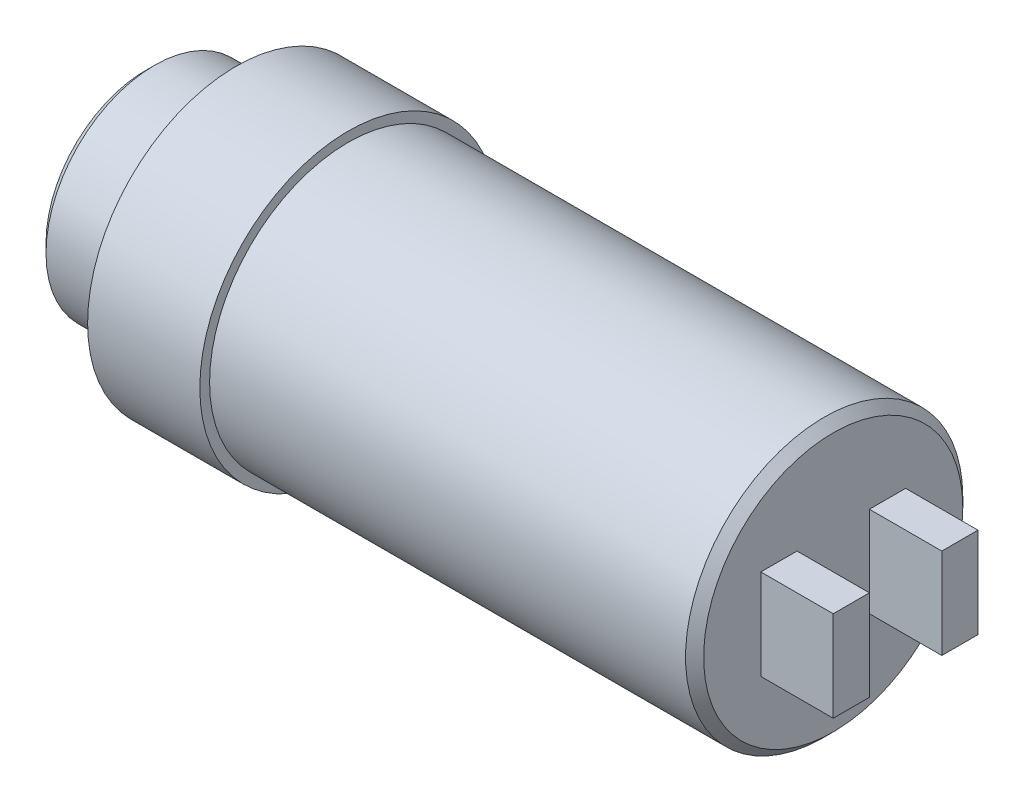
ISO-10303-21;
HEADER;
FILE_DESCRIPTION(('STEP AP214'),'2;1');
FILE_NAME('part.step','',(''),(''),'','','');
FILE_SCHEMA(('AUTOMOTIVE_DESIGN { 1 0 10303 214 1 1 1 1 }'));
ENDSEC;
DATA;
#1=APPLICATION_CONTEXT('core data for automotive mechanical design processes');
#2=APPLICATION_PROTOCOL_DEFINITION('international standard','automotive_design',2000,#1);
#3=PRODUCT_CONTEXT('',#1,'mechanical');
#4=PRODUCT('Part','Part','',(#3));
#5=PRODUCT_RELATED_PRODUCT_CATEGORY('part','',(#4));
#6=PRODUCT_DEFINITION_FORMATION('','',#4);
#7=PRODUCT_DEFINITION_CONTEXT('part definition',#1,'design');
#8=PRODUCT_DEFINITION('design','',#6,#7);
#9=PRODUCT_DEFINITION_SHAPE('','',#8);
#10=(LENGTH_UNIT() NAMED_UNIT(*) SI_UNIT(.MILLI.,.METRE.));
#11=(NAMED_UNIT(*) PLANE_ANGLE_UNIT() SI_UNIT($,.RADIAN.));
#12=(NAMED_UNIT(*) SI_UNIT($,.STERADIAN.) SOLID_ANGLE_UNIT());
#13=UNCERTAINTY_MEASURE_WITH_UNIT(LENGTH_MEASURE(1.E-05),#10,'distance_accuracy_value','');
#14=(GEOMETRIC_REPRESENTATION_CONTEXT(3) GLOBAL_UNCERTAINTY_ASSIGNED_CONTEXT((#13)) GLOBAL_UNIT_ASSIGNED_CONTEXT((#10,
#11,#12)) REPRESENTATION_CONTEXT('',''));
#15=CARTESIAN_POINT('',(0.,0.,0.));
#16=DIRECTION('',(0.,0.,1.));
#17=DIRECTION('',(1.,0.,0.));
#18=AXIS2_PLACEMENT_3D('',#15,#16,#17);
#19=CARTESIAN_POINT('',(0.,0.,0.));
#20=DIRECTION('',(-1.,0.,0.));
#21=DIRECTION('',(0.,0.,1.));
#22=AXIS2_PLACEMENT_3D('',#19,#20,#21);
#23=PLANE('',#22);
#24=CARTESIAN_POINT('',(0.,0.,0.));
#25=DIRECTION('',(-1.,0.,0.));
#26=DIRECTION('',(0.,0.,1.));
#27=AXIS2_PLACEMENT_3D('',#24,#25,#26);
#28=CIRCLE('',#27,2.75);
#29=CARTESIAN_POINT('',(0.,0.,2.75));
#30=VERTEX_POINT('',#29);
#31=EDGE_CURVE('E49',#30,#30,#28,.T.);
#32=ORIENTED_EDGE('',*,*,#31,.T.);
#33=EDGE_LOOP('',(#32));
#34=FACE_BOUND('',#33,.T.);
#35=CARTESIAN_POINT('',(0.,0.,0.));
#36=DIRECTION('',(-1.,0.,0.));
#37=DIRECTION('',(0.,0.,1.));
#38=AXIS2_PLACEMENT_3D('',#35,#36,#37);
#39=CIRCLE('',#38,1.99999999999999);
#40=CARTESIAN_POINT('',(0.,0.,1.99999999999999));
#41=VERTEX_POINT('',#40);
#42=EDGE_CURVE('E181',#41,#41,#39,.F.);
#43=ORIENTED_EDGE('',*,*,#42,.T.);
#44=EDGE_LOOP('',(#43));
#45=FACE_BOUND('',#44,.T.);
#46=ADVANCED_FACE('F40',(#34,#45),#23,.T.);
#47=CARTESIAN_POINT('',(19.,0.,0.));
#48=DIRECTION('',(1.,0.,0.));
#49=DIRECTION('',(0.,0.,-1.));
#50=AXIS2_PLACEMENT_3D('',#47,#48,#49);
#51=CYLINDRICAL_SURFACE('',#50,3.);
#52=CARTESIAN_POINT('',(0.249999999999997,0.,0.));
#53=DIRECTION('',(-1.,0.,0.));
#54=DIRECTION('',(0.,0.,1.));
#55=AXIS2_PLACEMENT_3D('',#52,#53,#54);
#56=CIRCLE('',#55,3.);
#57=CARTESIAN_POINT('',(0.249999999999997,0.,3.));
#58=VERTEX_POINT('',#57);
#59=EDGE_CURVE('E178',#58,#58,#56,.F.);
#60=ORIENTED_EDGE('',*,*,#59,.T.);
#61=EDGE_LOOP('',(#60));
#62=FACE_BOUND('',#61,.T.);
#63=CARTESIAN_POINT('',(2.5,0.,0.));
#64=DIRECTION('',(1.,0.,0.));
#65=DIRECTION('',(0.,0.,-1.));
#66=AXIS2_PLACEMENT_3D('',#63,#64,#65);
#67=CIRCLE('',#66,3.);
#68=CARTESIAN_POINT('',(2.5,0.,-3.));
#69=VERTEX_POINT('',#68);
#70=EDGE_CURVE('E169',#69,#69,#67,.T.);
#71=ORIENTED_EDGE('',*,*,#70,.F.);
#72=EDGE_LOOP('',(#71));
#73=FACE_BOUND('',#72,.T.);
#74=ADVANCED_FACE('F194',(#62,#73),#51,.T.);
#75=CARTESIAN_POINT('',(2.5,0.,-3.));
#76=DIRECTION('',(-1.,0.,0.));
#77=DIRECTION('',(0.,0.,1.));
#78=AXIS2_PLACEMENT_3D('',#75,#76,#77);
#79=PLANE('',#78);
#80=ORIENTED_EDGE('',*,*,#70,.T.);
#81=EDGE_LOOP('',(#80));
#82=FACE_BOUND('',#81,.T.);
#83=CARTESIAN_POINT('',(2.5,0.,0.));
#84=DIRECTION('',(-1.,0.,0.));
#85=DIRECTION('',(0.,0.,1.));
#86=AXIS2_PLACEMENT_3D('',#83,#84,#85);
#87=CIRCLE('',#86,4.10031535016329);
#88=CARTESIAN_POINT('',(2.5,0.,4.10031535016329));
#89=VERTEX_POINT('',#88);
#90=EDGE_CURVE('E207',#89,#89,#87,.T.);
#91=ORIENTED_EDGE('',*,*,#90,.T.);
#92=EDGE_LOOP('',(#91));
#93=FACE_BOUND('',#92,.T.);
#94=ADVANCED_FACE('F197',(#82,#93),#79,.T.);
#95=CARTESIAN_POINT('',(17.,0.,0.));
#96=DIRECTION('',(-1.,0.,0.));
#97=DIRECTION('',(0.,0.,1.));
#98=AXIS2_PLACEMENT_3D('',#95,#96,#97);
#99=CYLINDRICAL_SURFACE('',#98,1.75);
#100=CARTESIAN_POINT('',(0.249999999999997,0.,0.));
#101=DIRECTION('',(-1.,0.,0.));
#102=DIRECTION('',(0.,0.,1.));
#103=AXIS2_PLACEMENT_3D('',#100,#101,#102);
#104=CIRCLE('',#103,1.75);
#105=CARTESIAN_POINT('',(0.249999999999997,0.,1.75));
#106=VERTEX_POINT('',#105);
#107=EDGE_CURVE('E11',#106,#106,#104,.T.);
#108=ORIENTED_EDGE('',*,*,#107,.T.);
#109=EDGE_LOOP('',(#108));
#110=FACE_BOUND('',#109,.T.);
#111=CARTESIAN_POINT('',(17.,0.,0.));
#112=DIRECTION('',(-1.,0.,0.));
#113=DIRECTION('',(0.,0.,1.));
#114=AXIS2_PLACEMENT_3D('',#111,#112,#113);
#115=CIRCLE('',#114,1.75);
#116=CARTESIAN_POINT('',(17.,0.,1.75));
#117=VERTEX_POINT('',#116);
#118=EDGE_CURVE('E166',#117,#117,#115,.T.);
#119=ORIENTED_EDGE('',*,*,#118,.F.);
#120=EDGE_LOOP('',(#119));
#121=FACE_BOUND('',#120,.T.);
#122=ADVANCED_FACE('F203',(#110,#121),#99,.F.);
#123=CARTESIAN_POINT('',(17.,0.,0.));
#124=DIRECTION('',(-1.,0.,0.));
#125=DIRECTION('',(0.,0.,1.));
#126=AXIS2_PLACEMENT_3D('',#123,#124,#125);
#127=PLANE('',#126);
#128=ORIENTED_EDGE('',*,*,#118,.T.);
#129=EDGE_LOOP('',(#128));
#130=FACE_BOUND('',#129,.T.);
#131=ADVANCED_FACE('F191',(#130),#127,.T.);
#132=CARTESIAN_POINT('',(0.249999999999997,0.,0.));
#133=DIRECTION('',(1.,0.,0.));
#134=DIRECTION('',(0.,0.,-1.));
#135=AXIS2_PLACEMENT_3D('',#132,#133,#134);
#136=CONICAL_SURFACE('',#135,3.,0.78539816339745);
#137=ORIENTED_EDGE('',*,*,#31,.F.);
#138=EDGE_LOOP('',(#137));
#139=FACE_BOUND('',#138,.T.);
#140=ORIENTED_EDGE('',*,*,#59,.F.);
#141=EDGE_LOOP('',(#140));
#142=FACE_BOUND('',#141,.T.);
#143=ADVANCED_FACE('F188',(#139,#142),#136,.T.);
#144=CARTESIAN_POINT('',(0.249999999999997,0.,0.));
#145=DIRECTION('',(-1.,0.,0.));
#146=DIRECTION('',(0.,0.,1.));
#147=AXIS2_PLACEMENT_3D('',#144,#145,#146);
#148=CONICAL_SURFACE('',#147,1.75,0.785398163397445);
#149=ORIENTED_EDGE('',*,*,#42,.F.);
#150=EDGE_LOOP('',(#149));
#151=FACE_BOUND('',#150,.T.);
#152=ORIENTED_EDGE('',*,*,#107,.F.);
#153=EDGE_LOOP('',(#152));
#154=FACE_BOUND('',#153,.T.);
#155=ADVANCED_FACE('F43',(#151,#154),#148,.F.);
#156=CARTESIAN_POINT('',(5.6,0.,0.));
#157=DIRECTION('',(-1.,0.,0.));
#158=DIRECTION('',(0.,0.,1.));
#159=AXIS2_PLACEMENT_3D('',#156,#157,#158);
#160=CYLINDRICAL_SURFACE('',#159,4.10031535016329);
#161=CARTESIAN_POINT('',(5.6,0.,0.));
#162=DIRECTION('',(-1.,0.,0.));
#163=DIRECTION('',(0.,0.,1.));
#164=AXIS2_PLACEMENT_3D('',#161,#162,#163);
#165=CIRCLE('',#164,4.10031535016329);
#166=CARTESIAN_POINT('',(5.6,0.,4.10031535016329));
#167=VERTEX_POINT('',#166);
#168=EDGE_CURVE('E209',#167,#167,#165,.T.);
#169=CARTESIAN_POINT('',(5.6,0.,4.10031535016329));
#170=CARTESIAN_POINT('',(5.56770833333333,0.,4.10031535016329));
#171=CARTESIAN_POINT('',(5.53541666666667,0.,4.10031535016329));
#172=CARTESIAN_POINT('',(5.47083333333333,0.,4.10031535016329));
#173=CARTESIAN_POINT('',(5.43854166666667,0.,4.10031535016329));
#174=CARTESIAN_POINT('',(5.37395833333333,0.,4.10031535016329));
#175=CARTESIAN_POINT('',(5.34166666666667,0.,4.10031535016329));
#176=CARTESIAN_POINT('',(5.27708333333333,0.,4.10031535016329));
#177=CARTESIAN_POINT('',(5.24479166666667,0.,4.10031535016329));
#178=CARTESIAN_POINT('',(5.18020833333333,0.,4.10031535016329));
#179=CARTESIAN_POINT('',(5.14791666666667,0.,4.10031535016329));
#180=CARTESIAN_POINT('',(5.08333333333333,0.,4.10031535016329));
#181=CARTESIAN_POINT('',(5.05104166666667,0.,4.10031535016329));
#182=CARTESIAN_POINT('',(4.98645833333333,0.,4.10031535016329));
#183=CARTESIAN_POINT('',(4.95416666666667,0.,4.10031535016329));
#184=CARTESIAN_POINT('',(4.88958333333333,0.,4.10031535016329));
#185=CARTESIAN_POINT('',(4.85729166666667,0.,4.10031535016329));
#186=CARTESIAN_POINT('',(4.79270833333333,0.,4.10031535016329));
#187=CARTESIAN_POINT('',(4.76041666666667,0.,4.10031535016329));
#188=CARTESIAN_POINT('',(4.69583333333333,0.,4.10031535016329));
#189=CARTESIAN_POINT('',(4.66354166666667,0.,4.10031535016329));
#190=CARTESIAN_POINT('',(4.59895833333333,0.,4.10031535016329));
#191=CARTESIAN_POINT('',(4.56666666666667,0.,4.10031535016329));
#192=CARTESIAN_POINT('',(4.50208333333333,0.,4.10031535016329));
#193=CARTESIAN_POINT('',(4.46979166666667,0.,4.10031535016329));
#194=CARTESIAN_POINT('',(4.40520833333333,0.,4.10031535016329));
#195=CARTESIAN_POINT('',(4.37291666666667,0.,4.10031535016329));
#196=CARTESIAN_POINT('',(4.30833333333333,0.,4.10031535016329));
#197=CARTESIAN_POINT('',(4.27604166666667,0.,4.10031535016329));
#198=CARTESIAN_POINT('',(4.21145833333333,0.,4.10031535016329));
#199=CARTESIAN_POINT('',(4.17916666666667,0.,4.10031535016329));
#200=CARTESIAN_POINT('',(4.11458333333333,0.,4.10031535016329));
#201=CARTESIAN_POINT('',(4.08229166666667,0.,4.10031535016329));
#202=CARTESIAN_POINT('',(4.01770833333333,0.,4.10031535016329));
#203=CARTESIAN_POINT('',(3.98541666666667,0.,4.10031535016329));
#204=CARTESIAN_POINT('',(3.92083333333333,0.,4.10031535016329));
#205=CARTESIAN_POINT('',(3.88854166666667,0.,4.10031535016329));
#206=CARTESIAN_POINT('',(3.82395833333333,0.,4.10031535016329));
#207=CARTESIAN_POINT('',(3.79166666666667,0.,4.10031535016329));
#208=CARTESIAN_POINT('',(3.72708333333333,0.,4.10031535016329));
#209=CARTESIAN_POINT('',(3.69479166666667,0.,4.10031535016329));
#210=CARTESIAN_POINT('',(3.63020833333333,0.,4.10031535016329));
#211=CARTESIAN_POINT('',(3.59791666666667,0.,4.10031535016329));
#212=CARTESIAN_POINT('',(3.53333333333333,0.,4.10031535016329));
#213=CARTESIAN_POINT('',(3.50104166666667,0.,4.10031535016329));
#214=CARTESIAN_POINT('',(3.43645833333333,0.,4.10031535016329));
#215=CARTESIAN_POINT('',(3.40416666666667,0.,4.10031535016329));
#216=CARTESIAN_POINT('',(3.33958333333333,0.,4.10031535016329));
#217=CARTESIAN_POINT('',(3.30729166666667,0.,4.10031535016329));
#218=CARTESIAN_POINT('',(3.24270833333333,0.,4.10031535016329));
#219=CARTESIAN_POINT('',(3.21041666666667,0.,4.10031535016329));
#220=CARTESIAN_POINT('',(3.14583333333333,0.,4.10031535016329));
#221=CARTESIAN_POINT('',(3.11354166666667,0.,4.10031535016329));
#222=CARTESIAN_POINT('',(3.04895833333333,0.,4.10031535016329));
#223=CARTESIAN_POINT('',(3.01666666666667,0.,4.10031535016329));
#224=CARTESIAN_POINT('',(2.95208333333333,0.,4.10031535016329));
#225=CARTESIAN_POINT('',(2.91979166666667,0.,4.10031535016329));
#226=CARTESIAN_POINT('',(2.85520833333333,0.,4.10031535016329));
#227=CARTESIAN_POINT('',(2.82291666666667,0.,4.10031535016329));
#228=CARTESIAN_POINT('',(2.75833333333333,0.,4.10031535016329));
#229=CARTESIAN_POINT('',(2.72604166666667,0.,4.10031535016329));
#230=CARTESIAN_POINT('',(2.66145833333333,0.,4.10031535016329));
#231=CARTESIAN_POINT('',(2.62916666666667,0.,4.10031535016329));
#232=CARTESIAN_POINT('',(2.56458333333333,0.,4.10031535016329));
#233=CARTESIAN_POINT('',(2.53229166666667,0.,4.10031535016329));
#234=CARTESIAN_POINT('',(2.5,0.,4.10031535016329));
#235=B_SPLINE_CURVE_WITH_KNOTS('',3,(#169,#170,#171,#172,#173,#174,#175,#176,#177,#178,#179,
#180,#181,#182,#183,#184,#185,#186,#187,#188,#189,#190,#191,#192,#193,#194,#195,#196,#197,#198,
#199,#200,#201,#202,#203,#204,#205,#206,#207,#208,#209,#210,#211,#212,#213,#214,#215,#216,#217,
#218,#219,#220,#221,#222,#223,#224,#225,#226,#227,#228,#229,#230,#231,#232,#233,#234),
.UNSPECIFIED.,.F.,.F.,(4,2,2,2,2,2,2,2,2,2,2,2,2,2,2,2,2,2,2,2,2,2,2,2,2,2,2,2,2,2,2,2,4),(0.,
0.0968749999999997,0.193749999999999,0.290624999999999,0.3875,0.484375,0.581249999999999,
0.678125,0.775,0.871874999999999,0.96875,1.065625,1.1625,1.259375,1.35625,1.453125,1.55,
1.646875,1.74375,1.840625,1.9375,2.034375,2.13125,2.228125,2.325,2.421875,2.51875,2.615625,
2.7125,2.809375,2.90625,3.003125,3.1),.UNSPECIFIED.);
#236=EDGE_CURVE('BSEAM240',#167,#89,#235,.T.);
#237=ORIENTED_EDGE('',*,*,#168,.T.);
#238=ORIENTED_EDGE('',*,*,#90,.F.);
#239=ORIENTED_EDGE('',*,*,#236,.T.);
#240=ORIENTED_EDGE('',*,*,#236,.F.);
#241=EDGE_LOOP('',(#237,#239,#238,#240));
#242=FACE_BOUND('',#241,.T.);
#243=ADVANCED_FACE('F240',(#242),#160,.T.);
#244=CARTESIAN_POINT('',(5.6,0.,0.));
#245=DIRECTION('',(-1.,0.,0.));
#246=DIRECTION('',(0.,0.,1.));
#247=AXIS2_PLACEMENT_3D('',#244,#245,#246);
#248=PLANE('',#247);
#249=CARTESIAN_POINT('',(5.6,0.,0.));
#250=DIRECTION('',(-1.,0.,0.));
#251=DIRECTION('',(0.,0.,1.));
#252=AXIS2_PLACEMENT_3D('',#249,#250,#251);
#253=CIRCLE('',#252,3.83);
#254=CARTESIAN_POINT('',(5.6,0.,3.83));
#255=VERTEX_POINT('',#254);
#256=EDGE_CURVE('E210',#255,#255,#253,.T.);
#257=ORIENTED_EDGE('',*,*,#256,.T.);
#258=EDGE_LOOP('',(#257));
#259=FACE_BOUND('',#258,.T.);
#260=ORIENTED_EDGE('',*,*,#168,.F.);
#261=EDGE_LOOP('',(#260));
#262=FACE_BOUND('',#261,.T.);
#263=ADVANCED_FACE('F232',(#259,#262),#248,.F.);
#264=CARTESIAN_POINT('',(21.,0.,0.));
#265=DIRECTION('',(1.,0.,0.));
#266=DIRECTION('',(0.,0.,-1.));
#267=AXIS2_PLACEMENT_3D('',#264,#265,#266);
#268=PLANE('',#267);
#269=DIRECTION('',(0.,1.,0.));
#270=VECTOR('',#269,1.);
#271=CARTESIAN_POINT('',(21.,1.25,-2.));
#272=LINE('',#271,#270);
#273=CARTESIAN_POINT('',(21.,-1.25,-2.));
#274=VERTEX_POINT('',#273);
#275=CARTESIAN_POINT('',(21.,1.25,-2.));
#276=VERTEX_POINT('',#275);
#277=EDGE_CURVE('E116',#274,#276,#272,.T.);
#278=ORIENTED_EDGE('',*,*,#277,.T.);
#279=DIRECTION('',(0.,0.,1.));
#280=VECTOR('',#279,1.);
#281=CARTESIAN_POINT('',(21.,1.25,-1.));
#282=LINE('',#281,#280);
#283=CARTESIAN_POINT('',(21.,1.25,-1.));
#284=VERTEX_POINT('',#283);
#285=EDGE_CURVE('E140',#276,#284,#282,.T.);
#286=ORIENTED_EDGE('',*,*,#285,.T.);
#287=DIRECTION('',(0.,-1.,0.));
#288=VECTOR('',#287,1.);
#289=CARTESIAN_POINT('',(21.,1.25,-1.));
#290=LINE('',#289,#288);
#291=CARTESIAN_POINT('',(21.,-1.25,-1.));
#292=VERTEX_POINT('',#291);
#293=EDGE_CURVE('E138',#284,#292,#290,.T.);
#294=ORIENTED_EDGE('',*,*,#293,.T.);
#295=DIRECTION('',(0.,0.,-1.));
#296=VECTOR('',#295,1.);
#297=CARTESIAN_POINT('',(21.,-1.25,-1.));
#298=LINE('',#297,#296);
#299=EDGE_CURVE('E125',#292,#274,#298,.T.);
#300=ORIENTED_EDGE('',*,*,#299,.T.);
#301=EDGE_LOOP('',(#278,#286,#294,#300));
#302=FACE_BOUND('',#301,.T.);
#303=ADVANCED_FACE('F229',(#302),#268,.T.);
#304=CARTESIAN_POINT('',(21.,0.,0.));
#305=DIRECTION('',(1.,0.,0.));
#306=DIRECTION('',(0.,0.,-1.));
#307=AXIS2_PLACEMENT_3D('',#304,#305,#306);
#308=PLANE('',#307);
#309=DIRECTION('',(0.,1.,0.));
#310=VECTOR('',#309,1.);
#311=CARTESIAN_POINT('',(21.,1.25,1.));
#312=LINE('',#311,#310);
#313=CARTESIAN_POINT('',(21.,-1.25,0.999999999999999));
#314=VERTEX_POINT('',#313);
#315=CARTESIAN_POINT('',(21.,1.25,1.));
#316=VERTEX_POINT('',#315);
#317=EDGE_CURVE('E143',#314,#316,#312,.T.);
#318=ORIENTED_EDGE('',*,*,#317,.T.);
#319=DIRECTION('',(0.,0.,1.));
#320=VECTOR('',#319,1.);
#321=CARTESIAN_POINT('',(21.,1.25,2.));
#322=LINE('',#321,#320);
#323=CARTESIAN_POINT('',(21.,1.25,2.));
#324=VERTEX_POINT('',#323);
#325=EDGE_CURVE('E146',#316,#324,#322,.T.);
#326=ORIENTED_EDGE('',*,*,#325,.T.);
#327=DIRECTION('',(0.,-1.,0.));
#328=VECTOR('',#327,1.);
#329=CARTESIAN_POINT('',(21.,1.25,2.));
#330=LINE('',#329,#328);
#331=CARTESIAN_POINT('',(21.,-1.25,2.));
#332=VERTEX_POINT('',#331);
#333=EDGE_CURVE('E149',#324,#332,#330,.T.);
#334=ORIENTED_EDGE('',*,*,#333,.T.);
#335=DIRECTION('',(0.,0.,-1.));
#336=VECTOR('',#335,1.);
#337=CARTESIAN_POINT('',(21.,-1.25,2.));
#338=LINE('',#337,#336);
#339=EDGE_CURVE('E151',#332,#314,#338,.T.);
#340=ORIENTED_EDGE('',*,*,#339,.T.);
#341=EDGE_LOOP('',(#318,#326,#334,#340));
#342=FACE_BOUND('',#341,.T.);
#343=ADVANCED_FACE('F231',(#342),#308,.T.);
#344=CARTESIAN_POINT('',(21.,1.25,-1.));
#345=DIRECTION('',(0.,0.,-1.));
#346=DIRECTION('',(0.,1.,0.));
#347=AXIS2_PLACEMENT_3D('',#344,#345,#346);
#348=PLANE('',#347);
#349=DIRECTION('',(0.,-1.,0.));
#350=VECTOR('',#349,1.);
#351=CARTESIAN_POINT('',(19.,1.25,-1.));
#352=LINE('',#351,#350);
#353=CARTESIAN_POINT('',(19.,1.25,-1.));
#354=VERTEX_POINT('',#353);
#355=CARTESIAN_POINT('',(19.,-1.25,-1.));
#356=VERTEX_POINT('',#355);
#357=EDGE_CURVE('E115',#354,#356,#352,.T.);
#358=ORIENTED_EDGE('',*,*,#357,.T.);
#359=DIRECTION('',(-1.,0.,0.));
#360=VECTOR('',#359,1.);
#361=CARTESIAN_POINT('',(21.,-1.25,-1.));
#362=LINE('',#361,#360);
#363=EDGE_CURVE('E56',#292,#356,#362,.T.);
#364=ORIENTED_EDGE('',*,*,#363,.F.);
#365=ORIENTED_EDGE('',*,*,#293,.F.);
#366=DIRECTION('',(-1.,0.,0.));
#367=VECTOR('',#366,1.);
#368=CARTESIAN_POINT('',(21.,1.25,-1.));
#369=LINE('',#368,#367);
#370=EDGE_CURVE('E219',#284,#354,#369,.T.);
#371=ORIENTED_EDGE('',*,*,#370,.T.);
#372=EDGE_LOOP('',(#358,#364,#365,#371));
#373=FACE_BOUND('',#372,.T.);
#374=ADVANCED_FACE('F223',(#373),#348,.F.);
#375=CARTESIAN_POINT('',(21.,-1.25,-1.));
#376=DIRECTION('',(0.,1.,0.));
#377=DIRECTION('',(0.,0.,1.));
#378=AXIS2_PLACEMENT_3D('',#375,#376,#377);
#379=PLANE('',#378);
#380=DIRECTION('',(0.,0.,-1.));
#381=VECTOR('',#380,1.);
#382=CARTESIAN_POINT('',(19.,-1.25,-1.));
#383=LINE('',#382,#381);
#384=CARTESIAN_POINT('',(19.,-1.25,-2.));
#385=VERTEX_POINT('',#384);
#386=EDGE_CURVE('E107',#356,#385,#383,.T.);
#387=ORIENTED_EDGE('',*,*,#386,.T.);
#388=DIRECTION('',(-1.,0.,0.));
#389=VECTOR('',#388,1.);
#390=CARTESIAN_POINT('',(21.,-1.25,-2.));
#391=LINE('',#390,#389);
#392=EDGE_CURVE('E110',#274,#385,#391,.T.);
#393=ORIENTED_EDGE('',*,*,#392,.F.);
#394=ORIENTED_EDGE('',*,*,#299,.F.);
#395=ORIENTED_EDGE('',*,*,#363,.T.);
#396=EDGE_LOOP('',(#387,#393,#394,#395));
#397=FACE_BOUND('',#396,.T.);
#398=ADVANCED_FACE('F109',(#397),#379,.F.);
#399=CARTESIAN_POINT('',(21.,1.25,-2.));
#400=DIRECTION('',(0.,0.,1.));
#401=DIRECTION('',(0.,-1.,0.));
#402=AXIS2_PLACEMENT_3D('',#399,#400,#401);
#403=PLANE('',#402);
#404=DIRECTION('',(0.,1.,0.));
#405=VECTOR('',#404,1.);
#406=CARTESIAN_POINT('',(19.,1.25,-2.));
#407=LINE('',#406,#405);
#408=CARTESIAN_POINT('',(19.,1.25,-2.));
#409=VERTEX_POINT('',#408);
#410=EDGE_CURVE('E122',#385,#409,#407,.T.);
#411=ORIENTED_EDGE('',*,*,#410,.T.);
#412=DIRECTION('',(-1.,0.,0.));
#413=VECTOR('',#412,1.);
#414=CARTESIAN_POINT('',(21.,1.25,-2.));
#415=LINE('',#414,#413);
#416=EDGE_CURVE('E213',#276,#409,#415,.T.);
#417=ORIENTED_EDGE('',*,*,#416,.F.);
#418=ORIENTED_EDGE('',*,*,#277,.F.);
#419=ORIENTED_EDGE('',*,*,#392,.T.);
#420=EDGE_LOOP('',(#411,#417,#418,#419));
#421=FACE_BOUND('',#420,.T.);
#422=ADVANCED_FACE('F120',(#421),#403,.F.);
#423=CARTESIAN_POINT('',(21.,1.25,-1.));
#424=DIRECTION('',(0.,-1.,0.));
#425=DIRECTION('',(0.,0.,-1.));
#426=AXIS2_PLACEMENT_3D('',#423,#424,#425);
#427=PLANE('',#426);
#428=DIRECTION('',(0.,0.,1.));
#429=VECTOR('',#428,1.);
#430=CARTESIAN_POINT('',(19.,1.25,-1.));
#431=LINE('',#430,#429);
#432=EDGE_CURVE('E128',#409,#354,#431,.T.);
#433=ORIENTED_EDGE('',*,*,#432,.T.);
#434=ORIENTED_EDGE('',*,*,#370,.F.);
#435=ORIENTED_EDGE('',*,*,#285,.F.);
#436=ORIENTED_EDGE('',*,*,#416,.T.);
#437=EDGE_LOOP('',(#433,#434,#435,#436));
#438=FACE_BOUND('',#437,.T.);
#439=ADVANCED_FACE('F227',(#438),#427,.F.);
#440=CARTESIAN_POINT('',(21.,1.25,2.));
#441=DIRECTION('',(0.,0.,-1.));
#442=DIRECTION('',(0.,1.,0.));
#443=AXIS2_PLACEMENT_3D('',#440,#441,#442);
#444=PLANE('',#443);
#445=DIRECTION('',(0.,-1.,0.));
#446=VECTOR('',#445,1.);
#447=CARTESIAN_POINT('',(19.,1.25,2.));
#448=LINE('',#447,#446);
#449=CARTESIAN_POINT('',(19.,1.25,2.));
#450=VERTEX_POINT('',#449);
#451=CARTESIAN_POINT('',(19.,-1.25,2.));
#452=VERTEX_POINT('',#451);
#453=EDGE_CURVE('E155',#450,#452,#448,.T.);
#454=ORIENTED_EDGE('',*,*,#453,.T.);
#455=DIRECTION('',(-1.,0.,0.));
#456=VECTOR('',#455,1.);
#457=CARTESIAN_POINT('',(21.,-1.25,2.));
#458=LINE('',#457,#456);
#459=EDGE_CURVE('E64',#332,#452,#458,.T.);
#460=ORIENTED_EDGE('',*,*,#459,.F.);
#461=ORIENTED_EDGE('',*,*,#333,.F.);
#462=DIRECTION('',(-1.,0.,0.));
#463=VECTOR('',#462,1.);
#464=CARTESIAN_POINT('',(21.,1.25,2.));
#465=LINE('',#464,#463);
#466=EDGE_CURVE('E161',#324,#450,#465,.T.);
#467=ORIENTED_EDGE('',*,*,#466,.T.);
#468=EDGE_LOOP('',(#454,#460,#461,#467));
#469=FACE_BOUND('',#468,.T.);
#470=ADVANCED_FACE('F283',(#469),#444,.F.);
#471=CARTESIAN_POINT('',(21.,-1.25,2.));
#472=DIRECTION('',(0.,1.,0.));
#473=DIRECTION('',(0.,0.,1.));
#474=AXIS2_PLACEMENT_3D('',#471,#472,#473);
#475=PLANE('',#474);
#476=DIRECTION('',(0.,0.,-1.));
#477=VECTOR('',#476,1.);
#478=CARTESIAN_POINT('',(19.,-1.25,2.));
#479=LINE('',#478,#477);
#480=CARTESIAN_POINT('',(19.,-1.25,0.999999999999999));
#481=VERTEX_POINT('',#480);
#482=EDGE_CURVE('E147',#452,#481,#479,.T.);
#483=ORIENTED_EDGE('',*,*,#482,.T.);
#484=DIRECTION('',(-1.,0.,0.));
#485=VECTOR('',#484,1.);
#486=CARTESIAN_POINT('',(21.,-1.25,0.999999999999999));
#487=LINE('',#486,#485);
#488=EDGE_CURVE('E152',#314,#481,#487,.T.);
#489=ORIENTED_EDGE('',*,*,#488,.F.);
#490=ORIENTED_EDGE('',*,*,#339,.F.);
#491=ORIENTED_EDGE('',*,*,#459,.T.);
#492=EDGE_LOOP('',(#483,#489,#490,#491));
#493=FACE_BOUND('',#492,.T.);
#494=ADVANCED_FACE('F288',(#493),#475,.F.);
#495=CARTESIAN_POINT('',(21.,1.25,1.));
#496=DIRECTION('',(0.,0.,1.));
#497=DIRECTION('',(0.,-1.,0.));
#498=AXIS2_PLACEMENT_3D('',#495,#496,#497);
#499=PLANE('',#498);
#500=DIRECTION('',(0.,1.,0.));
#501=VECTOR('',#500,1.);
#502=CARTESIAN_POINT('',(19.,1.25,1.));
#503=LINE('',#502,#501);
#504=CARTESIAN_POINT('',(19.,1.25,1.));
#505=VERTEX_POINT('',#504);
#506=EDGE_CURVE('E129',#481,#505,#503,.T.);
#507=ORIENTED_EDGE('',*,*,#506,.T.);
#508=DIRECTION('',(-1.,0.,0.));
#509=VECTOR('',#508,1.);
#510=CARTESIAN_POINT('',(21.,1.25,1.));
#511=LINE('',#510,#509);
#512=EDGE_CURVE('E164',#316,#505,#511,.T.);
#513=ORIENTED_EDGE('',*,*,#512,.F.);
#514=ORIENTED_EDGE('',*,*,#317,.F.);
#515=ORIENTED_EDGE('',*,*,#488,.T.);
#516=EDGE_LOOP('',(#507,#513,#514,#515));
#517=FACE_BOUND('',#516,.T.);
#518=ADVANCED_FACE('F287',(#517),#499,.F.);
#519=CARTESIAN_POINT('',(21.,1.25,2.));
#520=DIRECTION('',(0.,-1.,0.));
#521=DIRECTION('',(0.,0.,-1.));
#522=AXIS2_PLACEMENT_3D('',#519,#520,#521);
#523=PLANE('',#522);
#524=DIRECTION('',(0.,0.,1.));
#525=VECTOR('',#524,1.);
#526=CARTESIAN_POINT('',(19.,1.25,2.));
#527=LINE('',#526,#525);
#528=EDGE_CURVE('E132',#505,#450,#527,.T.);
#529=ORIENTED_EDGE('',*,*,#528,.T.);
#530=ORIENTED_EDGE('',*,*,#466,.F.);
#531=ORIENTED_EDGE('',*,*,#325,.F.);
#532=ORIENTED_EDGE('',*,*,#512,.T.);
#533=EDGE_LOOP('',(#529,#530,#531,#532));
#534=FACE_BOUND('',#533,.T.);
#535=ADVANCED_FACE('F267',(#534),#523,.F.);
#536=CARTESIAN_POINT('',(19.,0.,-3.83));
#537=DIRECTION('',(1.,0.,0.));
#538=DIRECTION('',(0.,0.,-1.));
#539=AXIS2_PLACEMENT_3D('',#536,#537,#538);
#540=PLANE('',#539);
#541=CARTESIAN_POINT('',(19.,0.,0.));
#542=DIRECTION('',(1.,0.,0.));
#543=DIRECTION('',(0.,0.,-1.));
#544=AXIS2_PLACEMENT_3D('',#541,#542,#543);
#545=CIRCLE('',#544,3.58);
#546=CARTESIAN_POINT('',(19.,0.,-3.58));
#547=VERTEX_POINT('',#546);
#548=EDGE_CURVE('E172',#547,#547,#545,.T.);
#549=ORIENTED_EDGE('',*,*,#548,.T.);
#550=EDGE_LOOP('',(#549));
#551=FACE_BOUND('',#550,.T.);
#552=ORIENTED_EDGE('',*,*,#528,.F.);
#553=ORIENTED_EDGE('',*,*,#506,.F.);
#554=ORIENTED_EDGE('',*,*,#482,.F.);
#555=ORIENTED_EDGE('',*,*,#453,.F.);
#556=EDGE_LOOP('',(#552,#553,#554,#555));
#557=FACE_BOUND('',#556,.T.);
#558=ORIENTED_EDGE('',*,*,#432,.F.);
#559=ORIENTED_EDGE('',*,*,#410,.F.);
#560=ORIENTED_EDGE('',*,*,#386,.F.);
#561=ORIENTED_EDGE('',*,*,#357,.F.);
#562=EDGE_LOOP('',(#558,#559,#560,#561));
#563=FACE_BOUND('',#562,.T.);
#564=ADVANCED_FACE('F127',(#551,#557,#563),#540,.T.);
#565=CARTESIAN_POINT('',(19.,0.,0.));
#566=DIRECTION('',(-1.,0.,0.));
#567=DIRECTION('',(0.,0.,1.));
#568=AXIS2_PLACEMENT_3D('',#565,#566,#567);
#569=CONICAL_SURFACE('',#568,3.58,0.785398163397448);
#570=CARTESIAN_POINT('',(18.75,0.,0.));
#571=DIRECTION('',(1.,0.,0.));
#572=DIRECTION('',(0.,0.,-1.));
#573=AXIS2_PLACEMENT_3D('',#570,#571,#572);
#574=CIRCLE('',#573,3.83);
#575=CARTESIAN_POINT('',(18.75,0.,-3.83));
#576=VERTEX_POINT('',#575);
#577=EDGE_CURVE('E175',#576,#576,#574,.F.);
#578=ORIENTED_EDGE('',*,*,#577,.F.);
#579=EDGE_LOOP('',(#578));
#580=FACE_BOUND('',#579,.T.);
#581=ORIENTED_EDGE('',*,*,#548,.F.);
#582=EDGE_LOOP('',(#581));
#583=FACE_BOUND('',#582,.T.);
#584=ADVANCED_FACE('F250',(#580,#583),#569,.T.);
#585=CARTESIAN_POINT('',(19.,0.,0.));
#586=DIRECTION('',(1.,0.,0.));
#587=DIRECTION('',(0.,0.,-1.));
#588=AXIS2_PLACEMENT_3D('',#585,#586,#587);
#589=CYLINDRICAL_SURFACE('',#588,3.83);
#590=ORIENTED_EDGE('',*,*,#577,.T.);
#591=EDGE_LOOP('',(#590));
#592=FACE_BOUND('',#591,.T.);
#593=ORIENTED_EDGE('',*,*,#256,.F.);
#594=EDGE_LOOP('',(#593));
#595=FACE_BOUND('',#594,.T.);
#596=ADVANCED_FACE('F255',(#592,#595),#589,.T.);
#597=CLOSED_SHELL('',(#46,#74,#94,#122,#131,#143,#155,#243,#263,#303,#343,#374,#398,#422,#439,
#470,#494,#518,#535,#564,#584,#596));
#598=MANIFOLD_SOLID_BREP('B2',#597);
#599=ADVANCED_BREP_SHAPE_REPRESENTATION('',(#18,#598),#14);
#600=SHAPE_DEFINITION_REPRESENTATION(#9,#599);
ENDSEC;
END-ISO-10303-21;
